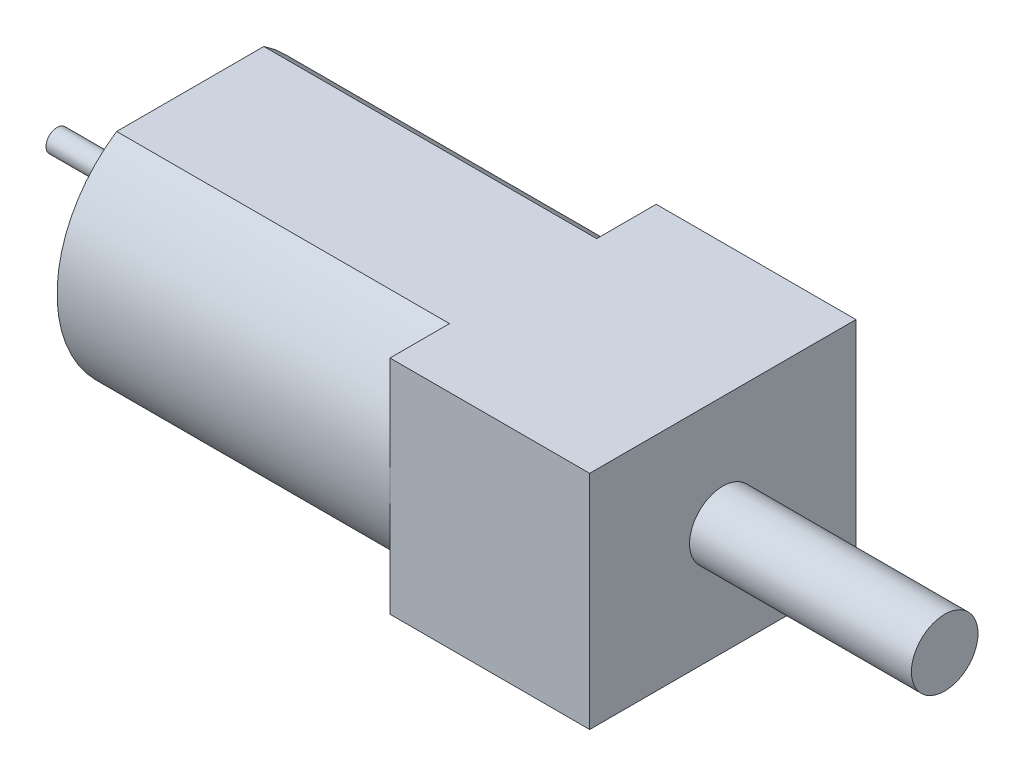
ISO-10303-21;
HEADER;
FILE_DESCRIPTION(('STEP AP214'),'2;1');
FILE_NAME('part.step','',(''),(''),'','','');
FILE_SCHEMA(('AUTOMOTIVE_DESIGN { 1 0 10303 214 1 1 1 1 }'));
ENDSEC;
DATA;
#1=APPLICATION_CONTEXT('core data for automotive mechanical design processes');
#2=APPLICATION_PROTOCOL_DEFINITION('international standard','automotive_design',2000,#1);
#3=PRODUCT_CONTEXT('',#1,'mechanical');
#4=PRODUCT('Part','Part','',(#3));
#5=PRODUCT_RELATED_PRODUCT_CATEGORY('part','',(#4));
#6=PRODUCT_DEFINITION_FORMATION('','',#4);
#7=PRODUCT_DEFINITION_CONTEXT('part definition',#1,'design');
#8=PRODUCT_DEFINITION('design','',#6,#7);
#9=PRODUCT_DEFINITION_SHAPE('','',#8);
#10=(LENGTH_UNIT() NAMED_UNIT(*) SI_UNIT(.MILLI.,.METRE.));
#11=(NAMED_UNIT(*) PLANE_ANGLE_UNIT() SI_UNIT($,.RADIAN.));
#12=(NAMED_UNIT(*) SI_UNIT($,.STERADIAN.) SOLID_ANGLE_UNIT());
#13=UNCERTAINTY_MEASURE_WITH_UNIT(LENGTH_MEASURE(1.E-05),#10,'distance_accuracy_value','');
#14=(GEOMETRIC_REPRESENTATION_CONTEXT(3) GLOBAL_UNCERTAINTY_ASSIGNED_CONTEXT((#13)) GLOBAL_UNIT_ASSIGNED_CONTEXT((#10,
#11,#12)) REPRESENTATION_CONTEXT('',''));
#15=CARTESIAN_POINT('',(0.,0.,0.));
#16=DIRECTION('',(0.,0.,1.));
#17=DIRECTION('',(1.,0.,0.));
#18=AXIS2_PLACEMENT_3D('',#15,#16,#17);
#19=CARTESIAN_POINT('',(0.,0.,0.));
#20=DIRECTION('',(-1.,0.,0.));
#21=DIRECTION('',(0.,0.,1.));
#22=AXIS2_PLACEMENT_3D('',#19,#20,#21);
#23=PLANE('',#22);
#24=DIRECTION('',(0.,0.,1.));
#25=VECTOR('',#24,1.);
#26=CARTESIAN_POINT('',(0.,10.,0.));
#27=LINE('',#26,#25);
#28=CARTESIAN_POINT('',(0.,10.,-9.3166247903554));
#29=VERTEX_POINT('',#28);
#30=CARTESIAN_POINT('',(0.,10.,-2.6833752096446));
#31=VERTEX_POINT('',#30);
#32=EDGE_CURVE('E149',#29,#31,#27,.T.);
#33=ORIENTED_EDGE('',*,*,#32,.F.);
#34=CARTESIAN_POINT('',(0.,5.,-6.));
#35=DIRECTION('',(-1.,0.,0.));
#36=DIRECTION('',(0.,0.,1.));
#37=AXIS2_PLACEMENT_3D('',#34,#35,#36);
#38=CIRCLE('',#37,6.);
#39=CARTESIAN_POINT('',(0.,0.,-9.3166247903554));
#40=VERTEX_POINT('',#39);
#41=EDGE_CURVE('E170',#29,#40,#38,.T.);
#42=ORIENTED_EDGE('',*,*,#41,.T.);
#43=DIRECTION('',(0.,0.,-1.));
#44=VECTOR('',#43,1.);
#45=CARTESIAN_POINT('',(0.,0.,0.));
#46=LINE('',#45,#44);
#47=CARTESIAN_POINT('',(0.,0.,-2.6833752096446));
#48=VERTEX_POINT('',#47);
#49=EDGE_CURVE('E145',#48,#40,#46,.T.);
#50=ORIENTED_EDGE('',*,*,#49,.F.);
#51=EDGE_CURVE('E169',#48,#31,#38,.T.);
#52=ORIENTED_EDGE('',*,*,#51,.T.);
#53=EDGE_LOOP('',(#33,#42,#50,#52));
#54=FACE_BOUND('',#53,.T.);
#55=CARTESIAN_POINT('',(0.,5.,-6.));
#56=DIRECTION('',(-1.,0.,0.));
#57=DIRECTION('',(0.,0.,1.));
#58=AXIS2_PLACEMENT_3D('',#55,#56,#57);
#59=CIRCLE('',#58,0.500000000000001);
#60=CARTESIAN_POINT('',(0.,5.,-5.5));
#61=VERTEX_POINT('',#60);
#62=EDGE_CURVE('E201',#61,#61,#59,.T.);
#63=ORIENTED_EDGE('',*,*,#62,.F.);
#64=EDGE_LOOP('',(#63));
#65=FACE_BOUND('',#64,.T.);
#66=ADVANCED_FACE('F33',(#54,#65),#23,.T.);
#67=CARTESIAN_POINT('',(24.,0.,0.));
#68=DIRECTION('',(0.,0.,-1.));
#69=DIRECTION('',(0.,1.,0.));
#70=AXIS2_PLACEMENT_3D('',#67,#68,#69);
#71=PLANE('',#70);
#72=DIRECTION('',(0.,1.,0.));
#73=VECTOR('',#72,1.);
#74=CARTESIAN_POINT('',(15.,0.,0.));
#75=LINE('',#74,#73);
#76=CARTESIAN_POINT('',(15.,0.,0.));
#77=VERTEX_POINT('',#76);
#78=CARTESIAN_POINT('',(15.,5.,0.));
#79=VERTEX_POINT('',#78);
#80=EDGE_CURVE('E105',#77,#79,#75,.T.);
#81=ORIENTED_EDGE('',*,*,#80,.F.);
#82=DIRECTION('',(-1.,0.,0.));
#83=VECTOR('',#82,1.);
#84=CARTESIAN_POINT('',(24.,0.,0.));
#85=LINE('',#84,#83);
#86=CARTESIAN_POINT('',(24.,0.,0.));
#87=VERTEX_POINT('',#86);
#88=EDGE_CURVE('E165',#87,#77,#85,.T.);
#89=ORIENTED_EDGE('',*,*,#88,.F.);
#90=DIRECTION('',(0.,-1.,0.));
#91=VECTOR('',#90,1.);
#92=CARTESIAN_POINT('',(24.,0.,0.));
#93=LINE('',#92,#91);
#94=CARTESIAN_POINT('',(24.,10.,0.));
#95=VERTEX_POINT('',#94);
#96=EDGE_CURVE('E146',#95,#87,#93,.T.);
#97=ORIENTED_EDGE('',*,*,#96,.F.);
#98=DIRECTION('',(-1.,0.,0.));
#99=VECTOR('',#98,1.);
#100=CARTESIAN_POINT('',(24.,10.,0.));
#101=LINE('',#100,#99);
#102=CARTESIAN_POINT('',(15.,10.,0.));
#103=VERTEX_POINT('',#102);
#104=EDGE_CURVE('E136',#95,#103,#101,.T.);
#105=ORIENTED_EDGE('',*,*,#104,.T.);
#106=EDGE_CURVE('E115',#79,#103,#75,.T.);
#107=ORIENTED_EDGE('',*,*,#106,.F.);
#108=EDGE_LOOP('',(#81,#89,#97,#105,#107));
#109=FACE_BOUND('',#108,.T.);
#110=ADVANCED_FACE('F35',(#109),#71,.F.);
#111=CARTESIAN_POINT('',(24.,0.,0.));
#112=DIRECTION('',(0.,1.,0.));
#113=DIRECTION('',(0.,0.,1.));
#114=AXIS2_PLACEMENT_3D('',#111,#112,#113);
#115=PLANE('',#114);
#116=DIRECTION('',(0.,0.,1.));
#117=VECTOR('',#116,1.);
#118=CARTESIAN_POINT('',(15.,0.,0.));
#119=LINE('',#118,#117);
#120=CARTESIAN_POINT('',(15.,0.,-12.));
#121=VERTEX_POINT('',#120);
#122=CARTESIAN_POINT('',(15.,0.,-9.3166247903554));
#123=VERTEX_POINT('',#122);
#124=EDGE_CURVE('E137',#121,#123,#119,.T.);
#125=ORIENTED_EDGE('',*,*,#124,.F.);
#126=DIRECTION('',(-1.,0.,0.));
#127=VECTOR('',#126,1.);
#128=CARTESIAN_POINT('',(24.,0.,-12.));
#129=LINE('',#128,#127);
#130=CARTESIAN_POINT('',(24.,0.,-12.));
#131=VERTEX_POINT('',#130);
#132=EDGE_CURVE('E162',#131,#121,#129,.T.);
#133=ORIENTED_EDGE('',*,*,#132,.F.);
#134=DIRECTION('',(0.,0.,-1.));
#135=VECTOR('',#134,1.);
#136=CARTESIAN_POINT('',(24.,0.,0.));
#137=LINE('',#136,#135);
#138=EDGE_CURVE('E148',#87,#131,#137,.T.);
#139=ORIENTED_EDGE('',*,*,#138,.F.);
#140=ORIENTED_EDGE('',*,*,#88,.T.);
#141=CARTESIAN_POINT('',(15.,0.,-2.6833752096446));
#142=VERTEX_POINT('',#141);
#143=EDGE_CURVE('E110',#142,#77,#119,.T.);
#144=ORIENTED_EDGE('',*,*,#143,.F.);
#145=DIRECTION('',(-1.,0.,0.));
#146=VECTOR('',#145,1.);
#147=CARTESIAN_POINT('',(15.,0.,-2.6833752096446));
#148=LINE('',#147,#146);
#149=EDGE_CURVE('E125',#48,#142,#148,.F.);
#150=ORIENTED_EDGE('',*,*,#149,.F.);
#151=ORIENTED_EDGE('',*,*,#49,.T.);
#152=DIRECTION('',(-1.,0.,0.));
#153=VECTOR('',#152,1.);
#154=CARTESIAN_POINT('',(15.,0.,-9.3166247903554));
#155=LINE('',#154,#153);
#156=EDGE_CURVE('E48',#123,#40,#155,.T.);
#157=ORIENTED_EDGE('',*,*,#156,.F.);
#158=EDGE_LOOP('',(#125,#133,#139,#140,#144,#150,#151,#157));
#159=FACE_BOUND('',#158,.T.);
#160=ADVANCED_FACE('F195',(#159),#115,.F.);
#161=CARTESIAN_POINT('',(24.,0.,-12.));
#162=DIRECTION('',(0.,0.,1.));
#163=DIRECTION('',(0.,-1.,0.));
#164=AXIS2_PLACEMENT_3D('',#161,#162,#163);
#165=PLANE('',#164);
#166=DIRECTION('',(0.,-1.,0.));
#167=VECTOR('',#166,1.);
#168=CARTESIAN_POINT('',(15.,0.,-12.));
#169=LINE('',#168,#167);
#170=CARTESIAN_POINT('',(15.,10.,-12.));
#171=VERTEX_POINT('',#170);
#172=CARTESIAN_POINT('',(15.,5.,-12.));
#173=VERTEX_POINT('',#172);
#174=EDGE_CURVE('E179',#171,#173,#169,.T.);
#175=ORIENTED_EDGE('',*,*,#174,.F.);
#176=DIRECTION('',(-1.,0.,0.));
#177=VECTOR('',#176,1.);
#178=CARTESIAN_POINT('',(24.,10.,-12.));
#179=LINE('',#178,#177);
#180=CARTESIAN_POINT('',(24.,10.,-12.));
#181=VERTEX_POINT('',#180);
#182=EDGE_CURVE('E159',#181,#171,#179,.T.);
#183=ORIENTED_EDGE('',*,*,#182,.F.);
#184=DIRECTION('',(0.,1.,0.));
#185=VECTOR('',#184,1.);
#186=CARTESIAN_POINT('',(24.,0.,-12.));
#187=LINE('',#186,#185);
#188=EDGE_CURVE('E151',#131,#181,#187,.T.);
#189=ORIENTED_EDGE('',*,*,#188,.F.);
#190=ORIENTED_EDGE('',*,*,#132,.T.);
#191=EDGE_CURVE('E138',#173,#121,#169,.T.);
#192=ORIENTED_EDGE('',*,*,#191,.F.);
#193=EDGE_LOOP('',(#175,#183,#189,#190,#192));
#194=FACE_BOUND('',#193,.T.);
#195=ADVANCED_FACE('F187',(#194),#165,.F.);
#196=CARTESIAN_POINT('',(24.,10.,0.));
#197=DIRECTION('',(0.,-1.,0.));
#198=DIRECTION('',(0.,0.,-1.));
#199=AXIS2_PLACEMENT_3D('',#196,#197,#198);
#200=PLANE('',#199);
#201=DIRECTION('',(0.,0.,-1.));
#202=VECTOR('',#201,1.);
#203=CARTESIAN_POINT('',(15.,10.,0.));
#204=LINE('',#203,#202);
#205=CARTESIAN_POINT('',(15.,10.,-2.6833752096446));
#206=VERTEX_POINT('',#205);
#207=EDGE_CURVE('E12',#103,#206,#204,.T.);
#208=ORIENTED_EDGE('',*,*,#207,.F.);
#209=ORIENTED_EDGE('',*,*,#104,.F.);
#210=DIRECTION('',(0.,0.,1.));
#211=VECTOR('',#210,1.);
#212=CARTESIAN_POINT('',(24.,10.,0.));
#213=LINE('',#212,#211);
#214=EDGE_CURVE('E56',#181,#95,#213,.T.);
#215=ORIENTED_EDGE('',*,*,#214,.F.);
#216=ORIENTED_EDGE('',*,*,#182,.T.);
#217=CARTESIAN_POINT('',(15.,10.,-9.3166247903554));
#218=VERTEX_POINT('',#217);
#219=EDGE_CURVE('E37',#218,#171,#204,.T.);
#220=ORIENTED_EDGE('',*,*,#219,.F.);
#221=DIRECTION('',(-1.,0.,0.));
#222=VECTOR('',#221,1.);
#223=CARTESIAN_POINT('',(15.,10.,-9.3166247903554));
#224=LINE('',#223,#222);
#225=EDGE_CURVE('E132',#29,#218,#224,.F.);
#226=ORIENTED_EDGE('',*,*,#225,.F.);
#227=ORIENTED_EDGE('',*,*,#32,.T.);
#228=DIRECTION('',(-1.,0.,0.));
#229=VECTOR('',#228,1.);
#230=CARTESIAN_POINT('',(15.,10.,-2.6833752096446));
#231=LINE('',#230,#229);
#232=EDGE_CURVE('E204',#206,#31,#231,.T.);
#233=ORIENTED_EDGE('',*,*,#232,.F.);
#234=EDGE_LOOP('',(#208,#209,#215,#216,#220,#226,#227,#233));
#235=FACE_BOUND('',#234,.T.);
#236=ADVANCED_FACE('F189',(#235),#200,.F.);
#237=CARTESIAN_POINT('',(24.,0.,0.));
#238=DIRECTION('',(-1.,0.,0.));
#239=DIRECTION('',(0.,0.,1.));
#240=AXIS2_PLACEMENT_3D('',#237,#238,#239);
#241=PLANE('',#240);
#242=ORIENTED_EDGE('',*,*,#96,.T.);
#243=ORIENTED_EDGE('',*,*,#138,.T.);
#244=ORIENTED_EDGE('',*,*,#188,.T.);
#245=ORIENTED_EDGE('',*,*,#214,.T.);
#246=EDGE_LOOP('',(#242,#243,#244,#245));
#247=FACE_BOUND('',#246,.T.);
#248=CARTESIAN_POINT('',(24.,5.,-6.));
#249=DIRECTION('',(-1.,0.,0.));
#250=DIRECTION('',(0.,0.,1.));
#251=AXIS2_PLACEMENT_3D('',#248,#249,#250);
#252=CIRCLE('',#251,1.5);
#253=CARTESIAN_POINT('',(24.,5.,-4.5));
#254=VERTEX_POINT('',#253);
#255=EDGE_CURVE('E167',#254,#254,#252,.F.);
#256=ORIENTED_EDGE('',*,*,#255,.F.);
#257=EDGE_LOOP('',(#256));
#258=FACE_BOUND('',#257,.T.);
#259=ADVANCED_FACE('F190',(#247,#258),#241,.F.);
#260=CARTESIAN_POINT('',(34.,5.,-6.));
#261=DIRECTION('',(-1.,0.,0.));
#262=DIRECTION('',(0.,0.,1.));
#263=AXIS2_PLACEMENT_3D('',#260,#261,#262);
#264=CYLINDRICAL_SURFACE('',#263,1.5);
#265=CARTESIAN_POINT('',(34.,5.,-6.));
#266=DIRECTION('',(1.,0.,0.));
#267=DIRECTION('',(0.,0.,-1.));
#268=AXIS2_PLACEMENT_3D('',#265,#266,#267);
#269=CIRCLE('',#268,1.5);
#270=CARTESIAN_POINT('',(34.,5.,-7.5));
#271=VERTEX_POINT('',#270);
#272=EDGE_CURVE('E142',#271,#271,#269,.T.);
#273=ORIENTED_EDGE('',*,*,#272,.F.);
#274=EDGE_LOOP('',(#273));
#275=FACE_BOUND('',#274,.T.);
#276=ORIENTED_EDGE('',*,*,#255,.T.);
#277=EDGE_LOOP('',(#276));
#278=FACE_BOUND('',#277,.T.);
#279=ADVANCED_FACE('F234',(#275,#278),#264,.T.);
#280=CARTESIAN_POINT('',(34.,5.,-6.));
#281=DIRECTION('',(1.,0.,0.));
#282=DIRECTION('',(0.,0.,-1.));
#283=AXIS2_PLACEMENT_3D('',#280,#281,#282);
#284=PLANE('',#283);
#285=ORIENTED_EDGE('',*,*,#272,.T.);
#286=EDGE_LOOP('',(#285));
#287=FACE_BOUND('',#286,.T.);
#288=ADVANCED_FACE('F229',(#287),#284,.T.);
#289=CARTESIAN_POINT('',(15.,5.,-6.));
#290=DIRECTION('',(-1.,0.,0.));
#291=DIRECTION('',(0.,0.,1.));
#292=AXIS2_PLACEMENT_3D('',#289,#290,#291);
#293=CYLINDRICAL_SURFACE('',#292,6.);
#294=CARTESIAN_POINT('',(15.,5.,-6.));
#295=DIRECTION('',(-1.,0.,0.));
#296=DIRECTION('',(0.,0.,1.));
#297=AXIS2_PLACEMENT_3D('',#294,#295,#296);
#298=CIRCLE('',#297,6.);
#299=EDGE_CURVE('E108',#142,#79,#298,.T.);
#300=ORIENTED_EDGE('',*,*,#299,.T.);
#301=EDGE_CURVE('E122',#79,#206,#298,.T.);
#302=ORIENTED_EDGE('',*,*,#301,.T.);
#303=ORIENTED_EDGE('',*,*,#232,.T.);
#304=ORIENTED_EDGE('',*,*,#51,.F.);
#305=ORIENTED_EDGE('',*,*,#149,.T.);
#306=EDGE_LOOP('',(#300,#302,#303,#304,#305));
#307=FACE_BOUND('',#306,.T.);
#308=ADVANCED_FACE('F120',(#307),#293,.T.);
#309=CARTESIAN_POINT('',(15.,5.,-6.));
#310=DIRECTION('',(-1.,0.,0.));
#311=DIRECTION('',(0.,0.,1.));
#312=AXIS2_PLACEMENT_3D('',#309,#310,#311);
#313=PLANE('',#312);
#314=ORIENTED_EDGE('',*,*,#106,.T.);
#315=ORIENTED_EDGE('',*,*,#207,.T.);
#316=ORIENTED_EDGE('',*,*,#301,.F.);
#317=EDGE_LOOP('',(#314,#315,#316));
#318=FACE_BOUND('',#317,.T.);
#319=ADVANCED_FACE('F130',(#318),#313,.T.);
#320=ORIENTED_EDGE('',*,*,#143,.T.);
#321=ORIENTED_EDGE('',*,*,#80,.T.);
#322=ORIENTED_EDGE('',*,*,#299,.F.);
#323=EDGE_LOOP('',(#320,#321,#322));
#324=FACE_BOUND('',#323,.T.);
#325=ADVANCED_FACE('F107',(#324),#313,.T.);
#326=ORIENTED_EDGE('',*,*,#124,.T.);
#327=EDGE_CURVE('E126',#173,#123,#298,.T.);
#328=ORIENTED_EDGE('',*,*,#327,.F.);
#329=ORIENTED_EDGE('',*,*,#191,.T.);
#330=EDGE_LOOP('',(#326,#328,#329));
#331=FACE_BOUND('',#330,.T.);
#332=ADVANCED_FACE('F197',(#331),#313,.T.);
#333=ORIENTED_EDGE('',*,*,#174,.T.);
#334=EDGE_CURVE('E133',#218,#173,#298,.T.);
#335=ORIENTED_EDGE('',*,*,#334,.F.);
#336=ORIENTED_EDGE('',*,*,#219,.T.);
#337=EDGE_LOOP('',(#333,#335,#336));
#338=FACE_BOUND('',#337,.T.);
#339=ADVANCED_FACE('F178',(#338),#313,.T.);
#340=ORIENTED_EDGE('',*,*,#156,.T.);
#341=ORIENTED_EDGE('',*,*,#41,.F.);
#342=ORIENTED_EDGE('',*,*,#225,.T.);
#343=ORIENTED_EDGE('',*,*,#334,.T.);
#344=ORIENTED_EDGE('',*,*,#327,.T.);
#345=EDGE_LOOP('',(#340,#341,#342,#343,#344));
#346=FACE_BOUND('',#345,.T.);
#347=ADVANCED_FACE('F198',(#346),#293,.T.);
#348=CARTESIAN_POINT('',(-6.,5.,-6.));
#349=DIRECTION('',(1.,0.,0.));
#350=DIRECTION('',(0.,0.,-1.));
#351=AXIS2_PLACEMENT_3D('',#348,#349,#350);
#352=CYLINDRICAL_SURFACE('',#351,0.500000000000001);
#353=CARTESIAN_POINT('',(-6.,5.,-6.));
#354=DIRECTION('',(-1.,0.,0.));
#355=DIRECTION('',(0.,0.,1.));
#356=AXIS2_PLACEMENT_3D('',#353,#354,#355);
#357=CIRCLE('',#356,0.500000000000001);
#358=CARTESIAN_POINT('',(-6.,5.,-5.5));
#359=VERTEX_POINT('',#358);
#360=EDGE_CURVE('E127',#359,#359,#357,.T.);
#361=ORIENTED_EDGE('',*,*,#360,.F.);
#362=EDGE_LOOP('',(#361));
#363=FACE_BOUND('',#362,.T.);
#364=ORIENTED_EDGE('',*,*,#62,.T.);
#365=EDGE_LOOP('',(#364));
#366=FACE_BOUND('',#365,.T.);
#367=ADVANCED_FACE('F218',(#363,#366),#352,.T.);
#368=CARTESIAN_POINT('',(-6.,5.,-6.));
#369=DIRECTION('',(-1.,0.,0.));
#370=DIRECTION('',(0.,0.,1.));
#371=AXIS2_PLACEMENT_3D('',#368,#369,#370);
#372=PLANE('',#371);
#373=ORIENTED_EDGE('',*,*,#360,.T.);
#374=EDGE_LOOP('',(#373));
#375=FACE_BOUND('',#374,.T.);
#376=ADVANCED_FACE('F216',(#375),#372,.T.);
#377=CLOSED_SHELL('',(#66,#110,#160,#195,#236,#259,#279,#288,#308,#319,#325,#332,#339,#347,#367,#376));
#378=MANIFOLD_SOLID_BREP('B2',#377);
#379=ADVANCED_BREP_SHAPE_REPRESENTATION('',(#18,#378),#14);
#380=SHAPE_DEFINITION_REPRESENTATION(#9,#379);
ENDSEC;
END-ISO-10303-21;
